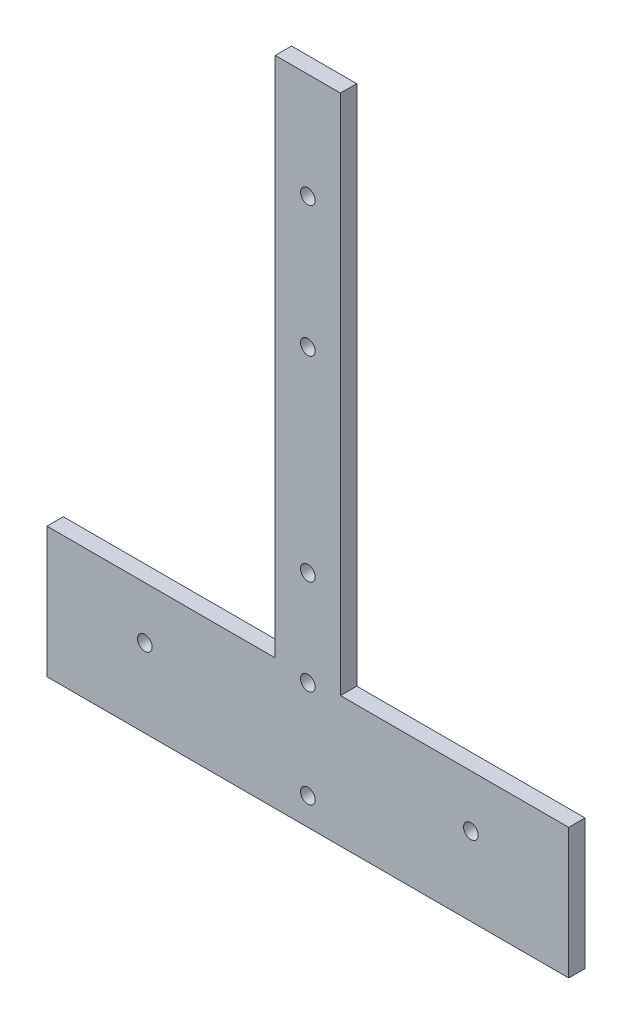
ISO-10303-21;
HEADER;
FILE_DESCRIPTION(('STEP AP214'),'2;1');
FILE_NAME('part.step','',(''),(''),'','','');
FILE_SCHEMA(('AUTOMOTIVE_DESIGN { 1 0 10303 214 1 1 1 1 }'));
ENDSEC;
DATA;
#1=APPLICATION_CONTEXT('core data for automotive mechanical design processes');
#2=APPLICATION_PROTOCOL_DEFINITION('international standard','automotive_design',2000,#1);
#3=PRODUCT_CONTEXT('',#1,'mechanical');
#4=PRODUCT('Part','Part','',(#3));
#5=PRODUCT_RELATED_PRODUCT_CATEGORY('part','',(#4));
#6=PRODUCT_DEFINITION_FORMATION('','',#4);
#7=PRODUCT_DEFINITION_CONTEXT('part definition',#1,'design');
#8=PRODUCT_DEFINITION('design','',#6,#7);
#9=PRODUCT_DEFINITION_SHAPE('','',#8);
#10=(LENGTH_UNIT() NAMED_UNIT(*) SI_UNIT(.MILLI.,.METRE.));
#11=(NAMED_UNIT(*) PLANE_ANGLE_UNIT() SI_UNIT($,.RADIAN.));
#12=(NAMED_UNIT(*) SI_UNIT($,.STERADIAN.) SOLID_ANGLE_UNIT());
#13=UNCERTAINTY_MEASURE_WITH_UNIT(LENGTH_MEASURE(1.E-05),#10,'distance_accuracy_value','');
#14=(GEOMETRIC_REPRESENTATION_CONTEXT(3) GLOBAL_UNCERTAINTY_ASSIGNED_CONTEXT((#13)) GLOBAL_UNIT_ASSIGNED_CONTEXT((#10,
#11,#12)) REPRESENTATION_CONTEXT('',''));
#15=CARTESIAN_POINT('',(0.,0.,0.));
#16=DIRECTION('',(0.,0.,1.));
#17=DIRECTION('',(1.,0.,0.));
#18=AXIS2_PLACEMENT_3D('',#15,#16,#17);
#19=CARTESIAN_POINT('',(-9.99999999999999,0.,5.));
#20=DIRECTION('',(-1.,0.,0.));
#21=DIRECTION('',(0.,0.,1.));
#22=AXIS2_PLACEMENT_3D('',#19,#20,#21);
#23=PLANE('',#22);
#24=DIRECTION('',(0.,1.,0.));
#25=VECTOR('',#24,1.);
#26=CARTESIAN_POINT('',(-9.99999999999999,0.,0.));
#27=LINE('',#26,#25);
#28=CARTESIAN_POINT('',(-9.99999999999999,-60.0000000000001,0.));
#29=VERTEX_POINT('',#28);
#30=CARTESIAN_POINT('',(-9.99999999999999,100.,0.));
#31=VERTEX_POINT('',#30);
#32=EDGE_CURVE('E131',#29,#31,#27,.T.);
#33=ORIENTED_EDGE('',*,*,#32,.F.);
#34=DIRECTION('',(0.,0.,-1.));
#35=VECTOR('',#34,1.);
#36=CARTESIAN_POINT('',(-9.99999999999999,-60.0000000000001,5.));
#37=LINE('',#36,#35);
#38=CARTESIAN_POINT('',(-9.99999999999999,-60.0000000000001,5.));
#39=VERTEX_POINT('',#38);
#40=EDGE_CURVE('E11',#39,#29,#37,.T.);
#41=ORIENTED_EDGE('',*,*,#40,.F.);
#42=DIRECTION('',(0.,1.,0.));
#43=VECTOR('',#42,1.);
#44=CARTESIAN_POINT('',(-9.99999999999999,0.,5.));
#45=LINE('',#44,#43);
#46=CARTESIAN_POINT('',(-9.99999999999999,100.,5.));
#47=VERTEX_POINT('',#46);
#48=EDGE_CURVE('E151',#39,#47,#45,.T.);
#49=ORIENTED_EDGE('',*,*,#48,.T.);
#50=DIRECTION('',(0.,0.,-1.));
#51=VECTOR('',#50,1.);
#52=CARTESIAN_POINT('',(-9.99999999999999,100.,5.));
#53=LINE('',#52,#51);
#54=EDGE_CURVE('E87',#47,#31,#53,.T.);
#55=ORIENTED_EDGE('',*,*,#54,.T.);
#56=EDGE_LOOP('',(#33,#41,#49,#55));
#57=FACE_BOUND('',#56,.T.);
#58=ADVANCED_FACE('F35',(#57),#23,.T.);
#59=CARTESIAN_POINT('',(0.,-60.0000000000001,5.));
#60=DIRECTION('',(0.,1.,0.));
#61=DIRECTION('',(0.,0.,1.));
#62=AXIS2_PLACEMENT_3D('',#59,#60,#61);
#63=PLANE('',#62);
#64=DIRECTION('',(1.,0.,0.));
#65=VECTOR('',#64,1.);
#66=CARTESIAN_POINT('',(0.,-60.0000000000001,0.));
#67=LINE('',#66,#65);
#68=CARTESIAN_POINT('',(-80.0000000000001,-60.0000000000001,0.));
#69=VERTEX_POINT('',#68);
#70=EDGE_CURVE('E134',#69,#29,#67,.T.);
#71=ORIENTED_EDGE('',*,*,#70,.F.);
#72=DIRECTION('',(0.,0.,-1.));
#73=VECTOR('',#72,1.);
#74=CARTESIAN_POINT('',(-80.0000000000001,-60.0000000000001,5.));
#75=LINE('',#74,#73);
#76=CARTESIAN_POINT('',(-80.0000000000001,-60.0000000000001,5.));
#77=VERTEX_POINT('',#76);
#78=EDGE_CURVE('E44',#77,#69,#75,.T.);
#79=ORIENTED_EDGE('',*,*,#78,.F.);
#80=DIRECTION('',(1.,0.,0.));
#81=VECTOR('',#80,1.);
#82=CARTESIAN_POINT('',(0.,-60.0000000000001,5.));
#83=LINE('',#82,#81);
#84=EDGE_CURVE('E202',#77,#39,#83,.T.);
#85=ORIENTED_EDGE('',*,*,#84,.T.);
#86=ORIENTED_EDGE('',*,*,#40,.T.);
#87=EDGE_LOOP('',(#71,#79,#85,#86));
#88=FACE_BOUND('',#87,.T.);
#89=ADVANCED_FACE('F231',(#88),#63,.T.);
#90=CARTESIAN_POINT('',(-80.0000000000001,0.,5.));
#91=DIRECTION('',(-1.,0.,0.));
#92=DIRECTION('',(0.,0.,1.));
#93=AXIS2_PLACEMENT_3D('',#90,#91,#92);
#94=PLANE('',#93);
#95=DIRECTION('',(0.,1.,0.));
#96=VECTOR('',#95,1.);
#97=CARTESIAN_POINT('',(-80.0000000000001,0.,0.));
#98=LINE('',#97,#96);
#99=CARTESIAN_POINT('',(-80.0000000000001,-100.,0.));
#100=VERTEX_POINT('',#99);
#101=EDGE_CURVE('E138',#100,#69,#98,.T.);
#102=ORIENTED_EDGE('',*,*,#101,.F.);
#103=DIRECTION('',(0.,0.,-1.));
#104=VECTOR('',#103,1.);
#105=CARTESIAN_POINT('',(-80.0000000000001,-100.,5.));
#106=LINE('',#105,#104);
#107=CARTESIAN_POINT('',(-80.0000000000001,-100.,5.));
#108=VERTEX_POINT('',#107);
#109=EDGE_CURVE('E157',#108,#100,#106,.T.);
#110=ORIENTED_EDGE('',*,*,#109,.F.);
#111=DIRECTION('',(0.,1.,0.));
#112=VECTOR('',#111,1.);
#113=CARTESIAN_POINT('',(-80.0000000000001,0.,5.));
#114=LINE('',#113,#112);
#115=EDGE_CURVE('E205',#108,#77,#114,.T.);
#116=ORIENTED_EDGE('',*,*,#115,.T.);
#117=ORIENTED_EDGE('',*,*,#78,.T.);
#118=EDGE_LOOP('',(#102,#110,#116,#117));
#119=FACE_BOUND('',#118,.T.);
#120=ADVANCED_FACE('F215',(#119),#94,.T.);
#121=CARTESIAN_POINT('',(0.,-100.,5.));
#122=DIRECTION('',(0.,-1.,0.));
#123=DIRECTION('',(0.,0.,-1.));
#124=AXIS2_PLACEMENT_3D('',#121,#122,#123);
#125=PLANE('',#124);
#126=DIRECTION('',(-1.,0.,0.));
#127=VECTOR('',#126,1.);
#128=CARTESIAN_POINT('',(0.,-100.,0.));
#129=LINE('',#128,#127);
#130=CARTESIAN_POINT('',(80.,-100.,0.));
#131=VERTEX_POINT('',#130);
#132=EDGE_CURVE('E141',#131,#100,#129,.T.);
#133=ORIENTED_EDGE('',*,*,#132,.F.);
#134=DIRECTION('',(0.,0.,-1.));
#135=VECTOR('',#134,1.);
#136=CARTESIAN_POINT('',(80.,-100.,5.));
#137=LINE('',#136,#135);
#138=CARTESIAN_POINT('',(80.,-100.,5.));
#139=VERTEX_POINT('',#138);
#140=EDGE_CURVE('E155',#139,#131,#137,.T.);
#141=ORIENTED_EDGE('',*,*,#140,.F.);
#142=DIRECTION('',(-1.,0.,0.));
#143=VECTOR('',#142,1.);
#144=CARTESIAN_POINT('',(0.,-100.,5.));
#145=LINE('',#144,#143);
#146=EDGE_CURVE('E126',#139,#108,#145,.T.);
#147=ORIENTED_EDGE('',*,*,#146,.T.);
#148=ORIENTED_EDGE('',*,*,#109,.T.);
#149=EDGE_LOOP('',(#133,#141,#147,#148));
#150=FACE_BOUND('',#149,.T.);
#151=ADVANCED_FACE('F210',(#150),#125,.T.);
#152=CARTESIAN_POINT('',(80.,0.,5.));
#153=DIRECTION('',(-1.,0.,0.));
#154=DIRECTION('',(0.,0.,1.));
#155=AXIS2_PLACEMENT_3D('',#152,#153,#154);
#156=PLANE('',#155);
#157=DIRECTION('',(0.,1.,0.));
#158=VECTOR('',#157,1.);
#159=CARTESIAN_POINT('',(80.,0.,0.));
#160=LINE('',#159,#158);
#161=CARTESIAN_POINT('',(80.,-60.0000000000001,0.));
#162=VERTEX_POINT('',#161);
#163=EDGE_CURVE('E144',#131,#162,#160,.T.);
#164=ORIENTED_EDGE('',*,*,#163,.T.);
#165=DIRECTION('',(0.,0.,-1.));
#166=VECTOR('',#165,1.);
#167=CARTESIAN_POINT('',(80.,-60.0000000000001,5.));
#168=LINE('',#167,#166);
#169=CARTESIAN_POINT('',(80.,-60.0000000000001,5.));
#170=VERTEX_POINT('',#169);
#171=EDGE_CURVE('E114',#170,#162,#168,.T.);
#172=ORIENTED_EDGE('',*,*,#171,.F.);
#173=DIRECTION('',(0.,1.,0.));
#174=VECTOR('',#173,1.);
#175=CARTESIAN_POINT('',(80.,0.,5.));
#176=LINE('',#175,#174);
#177=EDGE_CURVE('E123',#139,#170,#176,.T.);
#178=ORIENTED_EDGE('',*,*,#177,.F.);
#179=ORIENTED_EDGE('',*,*,#140,.T.);
#180=EDGE_LOOP('',(#164,#172,#178,#179));
#181=FACE_BOUND('',#180,.T.);
#182=ADVANCED_FACE('F221',(#181),#156,.F.);
#183=CARTESIAN_POINT('',(0.,-60.0000000000001,5.));
#184=DIRECTION('',(0.,1.,0.));
#185=DIRECTION('',(0.,0.,1.));
#186=AXIS2_PLACEMENT_3D('',#183,#184,#185);
#187=PLANE('',#186);
#188=DIRECTION('',(1.,0.,0.));
#189=VECTOR('',#188,1.);
#190=CARTESIAN_POINT('',(0.,-60.0000000000001,0.));
#191=LINE('',#190,#189);
#192=CARTESIAN_POINT('',(10.,-60.0000000000001,0.));
#193=VERTEX_POINT('',#192);
#194=EDGE_CURVE('E113',#193,#162,#191,.T.);
#195=ORIENTED_EDGE('',*,*,#194,.F.);
#196=DIRECTION('',(0.,0.,-1.));
#197=VECTOR('',#196,1.);
#198=CARTESIAN_POINT('',(10.,-60.0000000000001,5.));
#199=LINE('',#198,#197);
#200=CARTESIAN_POINT('',(10.,-60.0000000000001,5.));
#201=VERTEX_POINT('',#200);
#202=EDGE_CURVE('E107',#201,#193,#199,.T.);
#203=ORIENTED_EDGE('',*,*,#202,.F.);
#204=DIRECTION('',(1.,0.,0.));
#205=VECTOR('',#204,1.);
#206=CARTESIAN_POINT('',(0.,-60.0000000000001,5.));
#207=LINE('',#206,#205);
#208=EDGE_CURVE('E111',#201,#170,#207,.T.);
#209=ORIENTED_EDGE('',*,*,#208,.T.);
#210=ORIENTED_EDGE('',*,*,#171,.T.);
#211=EDGE_LOOP('',(#195,#203,#209,#210));
#212=FACE_BOUND('',#211,.T.);
#213=ADVANCED_FACE('F109',(#212),#187,.T.);
#214=CARTESIAN_POINT('',(10.,0.,5.));
#215=DIRECTION('',(-1.,0.,0.));
#216=DIRECTION('',(0.,0.,1.));
#217=AXIS2_PLACEMENT_3D('',#214,#215,#216);
#218=PLANE('',#217);
#219=DIRECTION('',(0.,1.,0.));
#220=VECTOR('',#219,1.);
#221=CARTESIAN_POINT('',(10.,0.,0.));
#222=LINE('',#221,#220);
#223=CARTESIAN_POINT('',(10.,100.,0.));
#224=VERTEX_POINT('',#223);
#225=EDGE_CURVE('E80',#193,#224,#222,.T.);
#226=ORIENTED_EDGE('',*,*,#225,.T.);
#227=DIRECTION('',(0.,0.,-1.));
#228=VECTOR('',#227,1.);
#229=CARTESIAN_POINT('',(10.,100.,5.));
#230=LINE('',#229,#228);
#231=CARTESIAN_POINT('',(10.,100.,5.));
#232=VERTEX_POINT('',#231);
#233=EDGE_CURVE('E115',#232,#224,#230,.T.);
#234=ORIENTED_EDGE('',*,*,#233,.F.);
#235=DIRECTION('',(0.,1.,0.));
#236=VECTOR('',#235,1.);
#237=CARTESIAN_POINT('',(10.,0.,5.));
#238=LINE('',#237,#236);
#239=EDGE_CURVE('E117',#201,#232,#238,.T.);
#240=ORIENTED_EDGE('',*,*,#239,.F.);
#241=ORIENTED_EDGE('',*,*,#202,.T.);
#242=EDGE_LOOP('',(#226,#234,#240,#241));
#243=FACE_BOUND('',#242,.T.);
#244=ADVANCED_FACE('F118',(#243),#218,.F.);
#245=CARTESIAN_POINT('',(0.,100.,5.));
#246=DIRECTION('',(0.,-1.,0.));
#247=DIRECTION('',(0.,0.,-1.));
#248=AXIS2_PLACEMENT_3D('',#245,#246,#247);
#249=PLANE('',#248);
#250=DIRECTION('',(-1.,0.,0.));
#251=VECTOR('',#250,1.);
#252=CARTESIAN_POINT('',(0.,100.,0.));
#253=LINE('',#252,#251);
#254=EDGE_CURVE('E149',#224,#31,#253,.T.);
#255=ORIENTED_EDGE('',*,*,#254,.T.);
#256=ORIENTED_EDGE('',*,*,#54,.F.);
#257=DIRECTION('',(-1.,0.,0.));
#258=VECTOR('',#257,1.);
#259=CARTESIAN_POINT('',(0.,100.,5.));
#260=LINE('',#259,#258);
#261=EDGE_CURVE('E53',#232,#47,#260,.T.);
#262=ORIENTED_EDGE('',*,*,#261,.F.);
#263=ORIENTED_EDGE('',*,*,#233,.T.);
#264=EDGE_LOOP('',(#255,#256,#262,#263));
#265=FACE_BOUND('',#264,.T.);
#266=ADVANCED_FACE('F238',(#265),#249,.F.);
#267=CARTESIAN_POINT('',(0.,0.,5.));
#268=DIRECTION('',(0.,0.,1.));
#269=DIRECTION('',(1.,0.,0.));
#270=AXIS2_PLACEMENT_3D('',#267,#268,#269);
#271=PLANE('',#270);
#272=CARTESIAN_POINT('',(0.,-61.6000000000001,5.));
#273=DIRECTION('',(0.,0.,1.));
#274=DIRECTION('',(1.,0.,0.));
#275=AXIS2_PLACEMENT_3D('',#272,#273,#274);
#276=CIRCLE('',#275,2.25);
#277=CARTESIAN_POINT('',(2.24999999999994,-61.6000000000001,5.));
#278=VERTEX_POINT('',#277);
#279=EDGE_CURVE('E190',#278,#278,#276,.T.);
#280=ORIENTED_EDGE('',*,*,#279,.F.);
#281=EDGE_LOOP('',(#280));
#282=FACE_BOUND('',#281,.T.);
#283=CARTESIAN_POINT('',(0.,-32.4000000000001,5.));
#284=DIRECTION('',(0.,0.,1.));
#285=DIRECTION('',(1.,0.,0.));
#286=AXIS2_PLACEMENT_3D('',#283,#284,#285);
#287=CIRCLE('',#286,2.25);
#288=CARTESIAN_POINT('',(2.25000000000001,-32.4000000000001,5.));
#289=VERTEX_POINT('',#288);
#290=EDGE_CURVE('E180',#289,#289,#287,.T.);
#291=ORIENTED_EDGE('',*,*,#290,.F.);
#292=EDGE_LOOP('',(#291));
#293=FACE_BOUND('',#292,.T.);
#294=CARTESIAN_POINT('',(0.,67.5999999999999,5.));
#295=DIRECTION('',(0.,0.,1.));
#296=DIRECTION('',(1.,0.,0.));
#297=AXIS2_PLACEMENT_3D('',#294,#295,#296);
#298=CIRCLE('',#297,2.25);
#299=CARTESIAN_POINT('',(2.25,67.5999999999999,5.));
#300=VERTEX_POINT('',#299);
#301=EDGE_CURVE('E177',#300,#300,#298,.T.);
#302=ORIENTED_EDGE('',*,*,#301,.F.);
#303=EDGE_LOOP('',(#302));
#304=FACE_BOUND('',#303,.T.);
#305=CARTESIAN_POINT('',(0.,27.5999999999999,5.));
#306=DIRECTION('',(0.,0.,1.));
#307=DIRECTION('',(1.,0.,0.));
#308=AXIS2_PLACEMENT_3D('',#305,#306,#307);
#309=CIRCLE('',#308,2.25);
#310=CARTESIAN_POINT('',(2.25,27.5999999999999,5.));
#311=VERTEX_POINT('',#310);
#312=EDGE_CURVE('E174',#311,#311,#309,.T.);
#313=ORIENTED_EDGE('',*,*,#312,.F.);
#314=EDGE_LOOP('',(#313));
#315=FACE_BOUND('',#314,.T.);
#316=CARTESIAN_POINT('',(50.,-76.0000000000001,5.));
#317=DIRECTION('',(0.,0.,1.));
#318=DIRECTION('',(1.,0.,0.));
#319=AXIS2_PLACEMENT_3D('',#316,#317,#318);
#320=CIRCLE('',#319,2.25);
#321=CARTESIAN_POINT('',(52.25,-76.0000000000001,5.));
#322=VERTEX_POINT('',#321);
#323=EDGE_CURVE('E170',#322,#322,#320,.T.);
#324=ORIENTED_EDGE('',*,*,#323,.F.);
#325=EDGE_LOOP('',(#324));
#326=FACE_BOUND('',#325,.T.);
#327=CARTESIAN_POINT('',(-50.0000000000001,-76.0000000000001,5.));
#328=DIRECTION('',(0.,0.,1.));
#329=DIRECTION('',(1.,0.,0.));
#330=AXIS2_PLACEMENT_3D('',#327,#328,#329);
#331=CIRCLE('',#330,2.25000000000001);
#332=CARTESIAN_POINT('',(-47.7500000000001,-76.0000000000001,5.));
#333=VERTEX_POINT('',#332);
#334=EDGE_CURVE('E166',#333,#333,#331,.T.);
#335=ORIENTED_EDGE('',*,*,#334,.F.);
#336=EDGE_LOOP('',(#335));
#337=FACE_BOUND('',#336,.T.);
#338=CARTESIAN_POINT('',(0.,-91.6000000000001,5.));
#339=DIRECTION('',(0.,0.,1.));
#340=DIRECTION('',(1.,0.,0.));
#341=AXIS2_PLACEMENT_3D('',#338,#339,#340);
#342=CIRCLE('',#341,2.25000000000001);
#343=CARTESIAN_POINT('',(2.24999999999994,-91.6000000000001,5.));
#344=VERTEX_POINT('',#343);
#345=EDGE_CURVE('E162',#344,#344,#342,.T.);
#346=ORIENTED_EDGE('',*,*,#345,.F.);
#347=EDGE_LOOP('',(#346));
#348=FACE_BOUND('',#347,.T.);
#349=ORIENTED_EDGE('',*,*,#48,.F.);
#350=ORIENTED_EDGE('',*,*,#84,.F.);
#351=ORIENTED_EDGE('',*,*,#115,.F.);
#352=ORIENTED_EDGE('',*,*,#146,.F.);
#353=ORIENTED_EDGE('',*,*,#177,.T.);
#354=ORIENTED_EDGE('',*,*,#208,.F.);
#355=ORIENTED_EDGE('',*,*,#239,.T.);
#356=ORIENTED_EDGE('',*,*,#261,.T.);
#357=EDGE_LOOP('',(#349,#350,#351,#352,#353,#354,#355,#356));
#358=FACE_BOUND('',#357,.T.);
#359=ADVANCED_FACE('F120',(#282,#293,#304,#315,#326,#337,#348,#358),#271,.T.);
#360=CARTESIAN_POINT('',(0.,0.,0.));
#361=DIRECTION('',(0.,0.,1.));
#362=DIRECTION('',(1.,0.,0.));
#363=AXIS2_PLACEMENT_3D('',#360,#361,#362);
#364=PLANE('',#363);
#365=CARTESIAN_POINT('',(0.,-61.6000000000001,0.));
#366=DIRECTION('',(0.,0.,1.));
#367=DIRECTION('',(1.,0.,0.));
#368=AXIS2_PLACEMENT_3D('',#365,#366,#367);
#369=CIRCLE('',#368,2.25);
#370=CARTESIAN_POINT('',(2.24999999999994,-61.6000000000001,0.));
#371=VERTEX_POINT('',#370);
#372=EDGE_CURVE('E38',#371,#371,#369,.T.);
#373=ORIENTED_EDGE('',*,*,#372,.T.);
#374=EDGE_LOOP('',(#373));
#375=FACE_BOUND('',#374,.T.);
#376=CARTESIAN_POINT('',(0.,-32.4000000000001,0.));
#377=DIRECTION('',(0.,0.,1.));
#378=DIRECTION('',(1.,0.,0.));
#379=AXIS2_PLACEMENT_3D('',#376,#377,#378);
#380=CIRCLE('',#379,2.25);
#381=CARTESIAN_POINT('',(2.25000000000001,-32.4000000000001,0.));
#382=VERTEX_POINT('',#381);
#383=EDGE_CURVE('E178',#382,#382,#380,.T.);
#384=ORIENTED_EDGE('',*,*,#383,.T.);
#385=EDGE_LOOP('',(#384));
#386=FACE_BOUND('',#385,.T.);
#387=CARTESIAN_POINT('',(0.,67.5999999999999,0.));
#388=DIRECTION('',(0.,0.,1.));
#389=DIRECTION('',(1.,0.,0.));
#390=AXIS2_PLACEMENT_3D('',#387,#388,#389);
#391=CIRCLE('',#390,2.25);
#392=CARTESIAN_POINT('',(2.25,67.5999999999999,0.));
#393=VERTEX_POINT('',#392);
#394=EDGE_CURVE('E175',#393,#393,#391,.T.);
#395=ORIENTED_EDGE('',*,*,#394,.T.);
#396=EDGE_LOOP('',(#395));
#397=FACE_BOUND('',#396,.T.);
#398=CARTESIAN_POINT('',(0.,27.5999999999999,0.));
#399=DIRECTION('',(0.,0.,1.));
#400=DIRECTION('',(1.,0.,0.));
#401=AXIS2_PLACEMENT_3D('',#398,#399,#400);
#402=CIRCLE('',#401,2.25);
#403=CARTESIAN_POINT('',(2.25,27.5999999999999,0.));
#404=VERTEX_POINT('',#403);
#405=EDGE_CURVE('E171',#404,#404,#402,.T.);
#406=ORIENTED_EDGE('',*,*,#405,.T.);
#407=EDGE_LOOP('',(#406));
#408=FACE_BOUND('',#407,.T.);
#409=CARTESIAN_POINT('',(50.,-76.0000000000001,0.));
#410=DIRECTION('',(0.,0.,1.));
#411=DIRECTION('',(1.,0.,0.));
#412=AXIS2_PLACEMENT_3D('',#409,#410,#411);
#413=CIRCLE('',#412,2.25);
#414=CARTESIAN_POINT('',(52.25,-76.0000000000001,0.));
#415=VERTEX_POINT('',#414);
#416=EDGE_CURVE('E167',#415,#415,#413,.T.);
#417=ORIENTED_EDGE('',*,*,#416,.T.);
#418=EDGE_LOOP('',(#417));
#419=FACE_BOUND('',#418,.T.);
#420=CARTESIAN_POINT('',(-50.0000000000001,-76.0000000000001,0.));
#421=DIRECTION('',(0.,0.,1.));
#422=DIRECTION('',(1.,0.,0.));
#423=AXIS2_PLACEMENT_3D('',#420,#421,#422);
#424=CIRCLE('',#423,2.25000000000001);
#425=CARTESIAN_POINT('',(-47.7500000000001,-76.0000000000001,0.));
#426=VERTEX_POINT('',#425);
#427=EDGE_CURVE('E163',#426,#426,#424,.T.);
#428=ORIENTED_EDGE('',*,*,#427,.T.);
#429=EDGE_LOOP('',(#428));
#430=FACE_BOUND('',#429,.T.);
#431=CARTESIAN_POINT('',(0.,-91.6000000000001,0.));
#432=DIRECTION('',(0.,0.,1.));
#433=DIRECTION('',(1.,0.,0.));
#434=AXIS2_PLACEMENT_3D('',#431,#432,#433);
#435=CIRCLE('',#434,2.25000000000001);
#436=CARTESIAN_POINT('',(2.24999999999994,-91.6000000000001,0.));
#437=VERTEX_POINT('',#436);
#438=EDGE_CURVE('E135',#437,#437,#435,.T.);
#439=ORIENTED_EDGE('',*,*,#438,.T.);
#440=EDGE_LOOP('',(#439));
#441=FACE_BOUND('',#440,.T.);
#442=ORIENTED_EDGE('',*,*,#32,.T.);
#443=ORIENTED_EDGE('',*,*,#254,.F.);
#444=ORIENTED_EDGE('',*,*,#225,.F.);
#445=ORIENTED_EDGE('',*,*,#194,.T.);
#446=ORIENTED_EDGE('',*,*,#163,.F.);
#447=ORIENTED_EDGE('',*,*,#132,.T.);
#448=ORIENTED_EDGE('',*,*,#101,.T.);
#449=ORIENTED_EDGE('',*,*,#70,.T.);
#450=EDGE_LOOP('',(#442,#443,#444,#445,#446,#447,#448,#449));
#451=FACE_BOUND('',#450,.T.);
#452=ADVANCED_FACE('F219',(#375,#386,#397,#408,#419,#430,#441,#451),#364,.F.);
#453=CARTESIAN_POINT('',(0.,-91.6000000000001,-10.));
#454=DIRECTION('',(0.,0.,1.));
#455=DIRECTION('',(1.,0.,0.));
#456=AXIS2_PLACEMENT_3D('',#453,#454,#455);
#457=CYLINDRICAL_SURFACE('',#456,2.25000000000001);
#458=ORIENTED_EDGE('',*,*,#345,.T.);
#459=EDGE_LOOP('',(#458));
#460=FACE_BOUND('',#459,.T.);
#461=ORIENTED_EDGE('',*,*,#438,.F.);
#462=EDGE_LOOP('',(#461));
#463=FACE_BOUND('',#462,.T.);
#464=ADVANCED_FACE('F250',(#460,#463),#457,.F.);
#465=CARTESIAN_POINT('',(-50.0000000000001,-76.0000000000001,-10.));
#466=DIRECTION('',(0.,0.,1.));
#467=DIRECTION('',(1.,0.,0.));
#468=AXIS2_PLACEMENT_3D('',#465,#466,#467);
#469=CYLINDRICAL_SURFACE('',#468,2.25000000000001);
#470=ORIENTED_EDGE('',*,*,#334,.T.);
#471=EDGE_LOOP('',(#470));
#472=FACE_BOUND('',#471,.T.);
#473=ORIENTED_EDGE('',*,*,#427,.F.);
#474=EDGE_LOOP('',(#473));
#475=FACE_BOUND('',#474,.T.);
#476=ADVANCED_FACE('F255',(#472,#475),#469,.F.);
#477=CARTESIAN_POINT('',(50.,-76.0000000000001,-10.));
#478=DIRECTION('',(0.,0.,1.));
#479=DIRECTION('',(1.,0.,0.));
#480=AXIS2_PLACEMENT_3D('',#477,#478,#479);
#481=CYLINDRICAL_SURFACE('',#480,2.25);
#482=ORIENTED_EDGE('',*,*,#323,.T.);
#483=EDGE_LOOP('',(#482));
#484=FACE_BOUND('',#483,.T.);
#485=ORIENTED_EDGE('',*,*,#416,.F.);
#486=EDGE_LOOP('',(#485));
#487=FACE_BOUND('',#486,.T.);
#488=ADVANCED_FACE('F259',(#484,#487),#481,.F.);
#489=CARTESIAN_POINT('',(0.,27.5999999999999,-10.));
#490=DIRECTION('',(0.,0.,1.));
#491=DIRECTION('',(1.,0.,0.));
#492=AXIS2_PLACEMENT_3D('',#489,#490,#491);
#493=CYLINDRICAL_SURFACE('',#492,2.25);
#494=ORIENTED_EDGE('',*,*,#312,.T.);
#495=EDGE_LOOP('',(#494));
#496=FACE_BOUND('',#495,.T.);
#497=ORIENTED_EDGE('',*,*,#405,.F.);
#498=EDGE_LOOP('',(#497));
#499=FACE_BOUND('',#498,.T.);
#500=ADVANCED_FACE('F263',(#496,#499),#493,.F.);
#501=CARTESIAN_POINT('',(0.,67.5999999999999,-10.));
#502=DIRECTION('',(0.,0.,1.));
#503=DIRECTION('',(1.,0.,0.));
#504=AXIS2_PLACEMENT_3D('',#501,#502,#503);
#505=CYLINDRICAL_SURFACE('',#504,2.25);
#506=ORIENTED_EDGE('',*,*,#301,.T.);
#507=EDGE_LOOP('',(#506));
#508=FACE_BOUND('',#507,.T.);
#509=ORIENTED_EDGE('',*,*,#394,.F.);
#510=EDGE_LOOP('',(#509));
#511=FACE_BOUND('',#510,.T.);
#512=ADVANCED_FACE('F267',(#508,#511),#505,.F.);
#513=CARTESIAN_POINT('',(0.,-32.4000000000001,-10.));
#514=DIRECTION('',(0.,0.,1.));
#515=DIRECTION('',(1.,0.,0.));
#516=AXIS2_PLACEMENT_3D('',#513,#514,#515);
#517=CYLINDRICAL_SURFACE('',#516,2.25);
#518=ORIENTED_EDGE('',*,*,#290,.T.);
#519=EDGE_LOOP('',(#518));
#520=FACE_BOUND('',#519,.T.);
#521=ORIENTED_EDGE('',*,*,#383,.F.);
#522=EDGE_LOOP('',(#521));
#523=FACE_BOUND('',#522,.T.);
#524=ADVANCED_FACE('F271',(#520,#523),#517,.F.);
#525=CARTESIAN_POINT('',(0.,-61.6000000000001,-10.));
#526=DIRECTION('',(0.,0.,1.));
#527=DIRECTION('',(1.,0.,0.));
#528=AXIS2_PLACEMENT_3D('',#525,#526,#527);
#529=CYLINDRICAL_SURFACE('',#528,2.25);
#530=ORIENTED_EDGE('',*,*,#279,.T.);
#531=EDGE_LOOP('',(#530));
#532=FACE_BOUND('',#531,.T.);
#533=ORIENTED_EDGE('',*,*,#372,.F.);
#534=EDGE_LOOP('',(#533));
#535=FACE_BOUND('',#534,.T.);
#536=ADVANCED_FACE('F275',(#532,#535),#529,.F.);
#537=CLOSED_SHELL('',(#58,#89,#120,#151,#182,#213,#244,#266,#359,#452,#464,#476,#488,#500,#512,
#524,#536));
#538=MANIFOLD_SOLID_BREP('B2',#537);
#539=ADVANCED_BREP_SHAPE_REPRESENTATION('',(#18,#538),#14);
#540=SHAPE_DEFINITION_REPRESENTATION(#9,#539);
ENDSEC;
END-ISO-10303-21;
